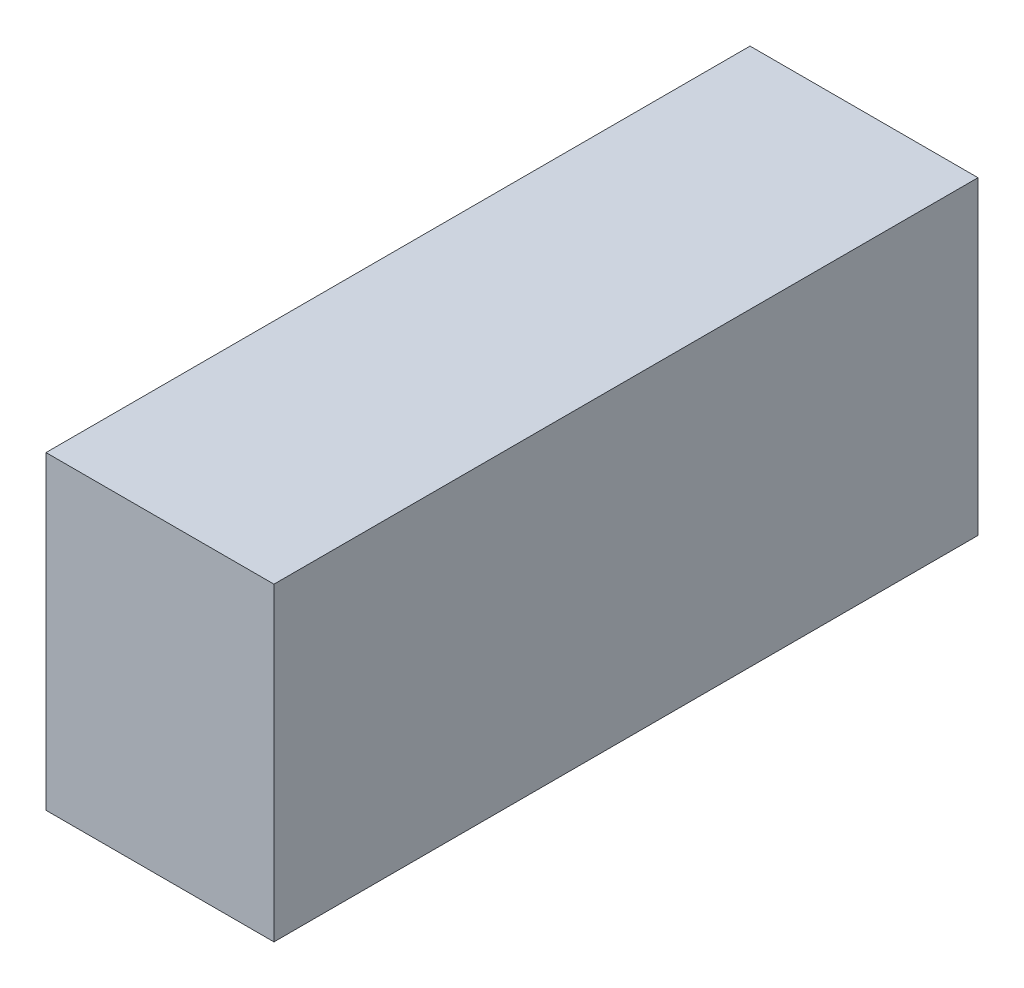
ISO-10303-21;
HEADER;
FILE_DESCRIPTION(('STEP AP214'),'2;1');
FILE_NAME('part.step','',(''),(''),'','','');
FILE_SCHEMA(('AUTOMOTIVE_DESIGN { 1 0 10303 214 1 1 1 1 }'));
ENDSEC;
DATA;
#1=APPLICATION_CONTEXT('core data for automotive mechanical design processes');
#2=APPLICATION_PROTOCOL_DEFINITION('international standard','automotive_design',2000,#1);
#3=PRODUCT_CONTEXT('',#1,'mechanical');
#4=PRODUCT('Part','Part','',(#3));
#5=PRODUCT_RELATED_PRODUCT_CATEGORY('part','',(#4));
#6=PRODUCT_DEFINITION_FORMATION('','',#4);
#7=PRODUCT_DEFINITION_CONTEXT('part definition',#1,'design');
#8=PRODUCT_DEFINITION('design','',#6,#7);
#9=PRODUCT_DEFINITION_SHAPE('','',#8);
#10=(LENGTH_UNIT() NAMED_UNIT(*) SI_UNIT(.MILLI.,.METRE.));
#11=(NAMED_UNIT(*) PLANE_ANGLE_UNIT() SI_UNIT($,.RADIAN.));
#12=(NAMED_UNIT(*) SI_UNIT($,.STERADIAN.) SOLID_ANGLE_UNIT());
#13=UNCERTAINTY_MEASURE_WITH_UNIT(LENGTH_MEASURE(1.E-05),#10,'distance_accuracy_value','');
#14=(GEOMETRIC_REPRESENTATION_CONTEXT(3) GLOBAL_UNCERTAINTY_ASSIGNED_CONTEXT((#13)) GLOBAL_UNIT_ASSIGNED_CONTEXT((#10,
#11,#12)) REPRESENTATION_CONTEXT('',''));
#15=CARTESIAN_POINT('',(0.,0.,0.));
#16=DIRECTION('',(0.,0.,1.));
#17=DIRECTION('',(1.,0.,0.));
#18=AXIS2_PLACEMENT_3D('',#15,#16,#17);
#19=CARTESIAN_POINT('',(0.,62.484,0.));
#20=DIRECTION('',(1.,0.,0.));
#21=DIRECTION('',(0.,0.,-1.));
#22=AXIS2_PLACEMENT_3D('',#19,#20,#21);
#23=PLANE('',#22);
#24=DIRECTION('',(0.,0.,1.));
#25=VECTOR('',#24,1.);
#26=CARTESIAN_POINT('',(0.,0.,0.));
#27=LINE('',#26,#25);
#28=CARTESIAN_POINT('',(0.,0.,-141.986));
#29=VERTEX_POINT('',#28);
#30=CARTESIAN_POINT('',(0.,0.,0.));
#31=VERTEX_POINT('',#30);
#32=EDGE_CURVE('E97',#29,#31,#27,.T.);
#33=ORIENTED_EDGE('',*,*,#32,.T.);
#34=DIRECTION('',(0.,-1.,0.));
#35=VECTOR('',#34,1.);
#36=CARTESIAN_POINT('',(0.,62.484,0.));
#37=LINE('',#36,#35);
#38=CARTESIAN_POINT('',(0.,62.484,0.));
#39=VERTEX_POINT('',#38);
#40=EDGE_CURVE('E11',#39,#31,#37,.T.);
#41=ORIENTED_EDGE('',*,*,#40,.F.);
#42=DIRECTION('',(0.,0.,1.));
#43=VECTOR('',#42,1.);
#44=CARTESIAN_POINT('',(0.,62.484,0.));
#45=LINE('',#44,#43);
#46=CARTESIAN_POINT('',(0.,62.484,-141.986));
#47=VERTEX_POINT('',#46);
#48=EDGE_CURVE('E85',#47,#39,#45,.T.);
#49=ORIENTED_EDGE('',*,*,#48,.F.);
#50=DIRECTION('',(0.,-1.,0.));
#51=VECTOR('',#50,1.);
#52=CARTESIAN_POINT('',(0.,62.484,-141.986));
#53=LINE('',#52,#51);
#54=EDGE_CURVE('E93',#47,#29,#53,.T.);
#55=ORIENTED_EDGE('',*,*,#54,.T.);
#56=EDGE_LOOP('',(#33,#41,#49,#55));
#57=FACE_BOUND('',#56,.T.);
#58=ADVANCED_FACE('F34',(#57),#23,.F.);
#59=CARTESIAN_POINT('',(0.,62.484,0.));
#60=DIRECTION('',(0.,0.,-1.));
#61=DIRECTION('',(-1.,0.,0.));
#62=AXIS2_PLACEMENT_3D('',#59,#60,#61);
#63=PLANE('',#62);
#64=DIRECTION('',(1.,0.,0.));
#65=VECTOR('',#64,1.);
#66=CARTESIAN_POINT('',(0.,0.,0.));
#67=LINE('',#66,#65);
#68=CARTESIAN_POINT('',(45.974,0.,0.));
#69=VERTEX_POINT('',#68);
#70=EDGE_CURVE('E89',#31,#69,#67,.T.);
#71=ORIENTED_EDGE('',*,*,#70,.T.);
#72=DIRECTION('',(0.,-1.,0.));
#73=VECTOR('',#72,1.);
#74=CARTESIAN_POINT('',(45.974,62.484,0.));
#75=LINE('',#74,#73);
#76=CARTESIAN_POINT('',(45.974,62.484,0.));
#77=VERTEX_POINT('',#76);
#78=EDGE_CURVE('E42',#77,#69,#75,.T.);
#79=ORIENTED_EDGE('',*,*,#78,.F.);
#80=DIRECTION('',(1.,0.,0.));
#81=VECTOR('',#80,1.);
#82=CARTESIAN_POINT('',(0.,62.484,0.));
#83=LINE('',#82,#81);
#84=EDGE_CURVE('E80',#39,#77,#83,.T.);
#85=ORIENTED_EDGE('',*,*,#84,.F.);
#86=ORIENTED_EDGE('',*,*,#40,.T.);
#87=EDGE_LOOP('',(#71,#79,#85,#86));
#88=FACE_BOUND('',#87,.T.);
#89=ADVANCED_FACE('F88',(#88),#63,.F.);
#90=CARTESIAN_POINT('',(45.974,62.484,0.));
#91=DIRECTION('',(-1.,0.,0.));
#92=DIRECTION('',(0.,0.,1.));
#93=AXIS2_PLACEMENT_3D('',#90,#91,#92);
#94=PLANE('',#93);
#95=DIRECTION('',(0.,0.,-1.));
#96=VECTOR('',#95,1.);
#97=CARTESIAN_POINT('',(45.974,0.,0.));
#98=LINE('',#97,#96);
#99=CARTESIAN_POINT('',(45.974,0.,-141.986));
#100=VERTEX_POINT('',#99);
#101=EDGE_CURVE('E67',#69,#100,#98,.T.);
#102=ORIENTED_EDGE('',*,*,#101,.T.);
#103=DIRECTION('',(0.,-1.,0.));
#104=VECTOR('',#103,1.);
#105=CARTESIAN_POINT('',(45.974,62.484,-141.986));
#106=LINE('',#105,#104);
#107=CARTESIAN_POINT('',(45.974,62.484,-141.986));
#108=VERTEX_POINT('',#107);
#109=EDGE_CURVE('E90',#108,#100,#106,.T.);
#110=ORIENTED_EDGE('',*,*,#109,.F.);
#111=DIRECTION('',(0.,0.,-1.));
#112=VECTOR('',#111,1.);
#113=CARTESIAN_POINT('',(45.974,62.484,0.));
#114=LINE('',#113,#112);
#115=EDGE_CURVE('E83',#77,#108,#114,.T.);
#116=ORIENTED_EDGE('',*,*,#115,.F.);
#117=ORIENTED_EDGE('',*,*,#78,.T.);
#118=EDGE_LOOP('',(#102,#110,#116,#117));
#119=FACE_BOUND('',#118,.T.);
#120=ADVANCED_FACE('F91',(#119),#94,.F.);
#121=CARTESIAN_POINT('',(0.,62.484,-141.986));
#122=DIRECTION('',(0.,0.,1.));
#123=DIRECTION('',(1.,0.,0.));
#124=AXIS2_PLACEMENT_3D('',#121,#122,#123);
#125=PLANE('',#124);
#126=DIRECTION('',(-1.,0.,0.));
#127=VECTOR('',#126,1.);
#128=CARTESIAN_POINT('',(0.,0.,-141.986));
#129=LINE('',#128,#127);
#130=EDGE_CURVE('E73',#100,#29,#129,.T.);
#131=ORIENTED_EDGE('',*,*,#130,.T.);
#132=ORIENTED_EDGE('',*,*,#54,.F.);
#133=DIRECTION('',(-1.,0.,0.));
#134=VECTOR('',#133,1.);
#135=CARTESIAN_POINT('',(0.,62.484,-141.986));
#136=LINE('',#135,#134);
#137=EDGE_CURVE('E50',#108,#47,#136,.T.);
#138=ORIENTED_EDGE('',*,*,#137,.F.);
#139=ORIENTED_EDGE('',*,*,#109,.T.);
#140=EDGE_LOOP('',(#131,#132,#138,#139));
#141=FACE_BOUND('',#140,.T.);
#142=ADVANCED_FACE('F104',(#141),#125,.F.);
#143=CARTESIAN_POINT('',(0.,62.484,0.));
#144=DIRECTION('',(0.,-1.,0.));
#145=DIRECTION('',(0.,0.,-1.));
#146=AXIS2_PLACEMENT_3D('',#143,#144,#145);
#147=PLANE('',#146);
#148=ORIENTED_EDGE('',*,*,#48,.T.);
#149=ORIENTED_EDGE('',*,*,#84,.T.);
#150=ORIENTED_EDGE('',*,*,#115,.T.);
#151=ORIENTED_EDGE('',*,*,#137,.T.);
#152=EDGE_LOOP('',(#148,#149,#150,#151));
#153=FACE_BOUND('',#152,.T.);
#154=ADVANCED_FACE('F81',(#153),#147,.F.);
#155=CARTESIAN_POINT('',(0.,0.,0.));
#156=DIRECTION('',(0.,-1.,0.));
#157=DIRECTION('',(0.,0.,-1.));
#158=AXIS2_PLACEMENT_3D('',#155,#156,#157);
#159=PLANE('',#158);
#160=ORIENTED_EDGE('',*,*,#32,.F.);
#161=ORIENTED_EDGE('',*,*,#130,.F.);
#162=ORIENTED_EDGE('',*,*,#101,.F.);
#163=ORIENTED_EDGE('',*,*,#70,.F.);
#164=EDGE_LOOP('',(#160,#161,#162,#163));
#165=FACE_BOUND('',#164,.T.);
#166=ADVANCED_FACE('F107',(#165),#159,.T.);
#167=CLOSED_SHELL('',(#58,#89,#120,#142,#154,#166));
#168=MANIFOLD_SOLID_BREP('B2',#167);
#169=ADVANCED_BREP_SHAPE_REPRESENTATION('',(#18,#168),#14);
#170=SHAPE_DEFINITION_REPRESENTATION(#9,#169);
ENDSEC;
END-ISO-10303-21;
